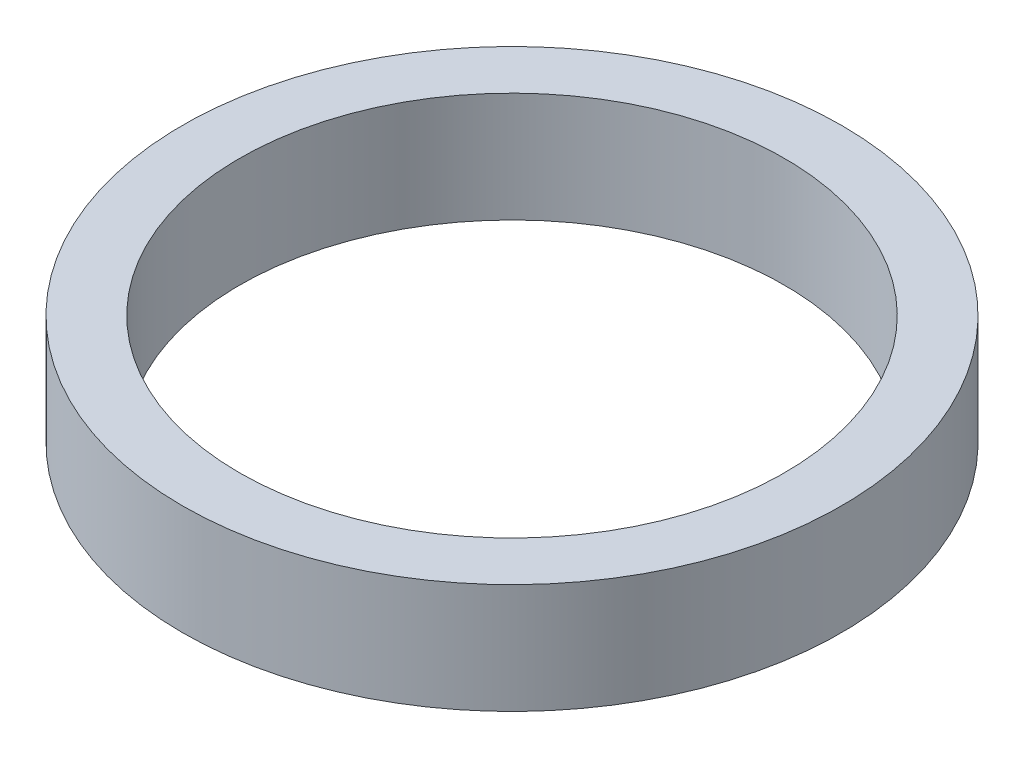
ISO-10303-21;
HEADER;
FILE_DESCRIPTION(('STEP AP214'),'2;1');
FILE_NAME('part.step','',(''),(''),'','','');
FILE_SCHEMA(('AUTOMOTIVE_DESIGN { 1 0 10303 214 1 1 1 1 }'));
ENDSEC;
DATA;
#1=APPLICATION_CONTEXT('core data for automotive mechanical design processes');
#2=APPLICATION_PROTOCOL_DEFINITION('international standard','automotive_design',2000,#1);
#3=PRODUCT_CONTEXT('',#1,'mechanical');
#4=PRODUCT('Part','Part','',(#3));
#5=PRODUCT_RELATED_PRODUCT_CATEGORY('part','',(#4));
#6=PRODUCT_DEFINITION_FORMATION('','',#4);
#7=PRODUCT_DEFINITION_CONTEXT('part definition',#1,'design');
#8=PRODUCT_DEFINITION('design','',#6,#7);
#9=PRODUCT_DEFINITION_SHAPE('','',#8);
#10=(LENGTH_UNIT() NAMED_UNIT(*) SI_UNIT(.MILLI.,.METRE.));
#11=(NAMED_UNIT(*) PLANE_ANGLE_UNIT() SI_UNIT($,.RADIAN.));
#12=(NAMED_UNIT(*) SI_UNIT($,.STERADIAN.) SOLID_ANGLE_UNIT());
#13=UNCERTAINTY_MEASURE_WITH_UNIT(LENGTH_MEASURE(1.E-05),#10,'distance_accuracy_value','');
#14=(GEOMETRIC_REPRESENTATION_CONTEXT(3) GLOBAL_UNCERTAINTY_ASSIGNED_CONTEXT((#13)) GLOBAL_UNIT_ASSIGNED_CONTEXT((#10,
#11,#12)) REPRESENTATION_CONTEXT('',''));
#15=CARTESIAN_POINT('',(0.,0.,0.));
#16=DIRECTION('',(0.,0.,1.));
#17=DIRECTION('',(1.,0.,0.));
#18=AXIS2_PLACEMENT_3D('',#15,#16,#17);
#19=CARTESIAN_POINT('',(0.,1.25,0.));
#20=DIRECTION('',(0.,1.,0.));
#21=DIRECTION('',(0.,0.,1.));
#22=AXIS2_PLACEMENT_3D('',#19,#20,#21);
#23=PLANE('',#22);
#24=CARTESIAN_POINT('',(0.,1.25,0.));
#25=DIRECTION('',(0.,1.,0.));
#26=DIRECTION('',(0.,0.,1.));
#27=AXIS2_PLACEMENT_3D('',#24,#25,#26);
#28=CIRCLE('',#27,3.75);
#29=CARTESIAN_POINT('',(0.,1.25,3.75));
#30=VERTEX_POINT('',#29);
#31=EDGE_CURVE('E10',#30,#30,#28,.T.);
#32=ORIENTED_EDGE('',*,*,#31,.T.);
#33=EDGE_LOOP('',(#32));
#34=FACE_BOUND('',#33,.T.);
#35=CARTESIAN_POINT('',(0.,1.25,0.));
#36=DIRECTION('',(0.,1.,0.));
#37=DIRECTION('',(0.,0.,1.));
#38=AXIS2_PLACEMENT_3D('',#35,#36,#37);
#39=CIRCLE('',#38,3.1);
#40=CARTESIAN_POINT('',(0.,1.25,3.1));
#41=VERTEX_POINT('',#40);
#42=EDGE_CURVE('E52',#41,#41,#39,.T.);
#43=ORIENTED_EDGE('',*,*,#42,.F.);
#44=EDGE_LOOP('',(#43));
#45=FACE_BOUND('',#44,.T.);
#46=ADVANCED_FACE('F41',(#34,#45),#23,.T.);
#47=CARTESIAN_POINT('',(0.,0.,0.));
#48=DIRECTION('',(0.,1.,0.));
#49=DIRECTION('',(0.,0.,1.));
#50=AXIS2_PLACEMENT_3D('',#47,#48,#49);
#51=PLANE('',#50);
#52=CARTESIAN_POINT('',(0.,0.,0.));
#53=DIRECTION('',(0.,1.,0.));
#54=DIRECTION('',(0.,0.,1.));
#55=AXIS2_PLACEMENT_3D('',#52,#53,#54);
#56=CIRCLE('',#55,3.75);
#57=CARTESIAN_POINT('',(0.,0.,3.75));
#58=VERTEX_POINT('',#57);
#59=EDGE_CURVE('E45',#58,#58,#56,.T.);
#60=ORIENTED_EDGE('',*,*,#59,.F.);
#61=EDGE_LOOP('',(#60));
#62=FACE_BOUND('',#61,.T.);
#63=CARTESIAN_POINT('',(0.,0.,0.));
#64=DIRECTION('',(0.,1.,0.));
#65=DIRECTION('',(0.,0.,1.));
#66=AXIS2_PLACEMENT_3D('',#63,#64,#65);
#67=CIRCLE('',#66,3.1);
#68=CARTESIAN_POINT('',(0.,0.,3.1));
#69=VERTEX_POINT('',#68);
#70=EDGE_CURVE('E54',#69,#69,#67,.T.);
#71=ORIENTED_EDGE('',*,*,#70,.T.);
#72=EDGE_LOOP('',(#71));
#73=FACE_BOUND('',#72,.T.);
#74=ADVANCED_FACE('F64',(#62,#73),#51,.F.);
#75=CARTESIAN_POINT('',(0.,1.25,0.));
#76=DIRECTION('',(0.,-1.,0.));
#77=DIRECTION('',(0.,0.,-1.));
#78=AXIS2_PLACEMENT_3D('',#75,#76,#77);
#79=CYLINDRICAL_SURFACE('',#78,3.75);
#80=ORIENTED_EDGE('',*,*,#31,.F.);
#81=EDGE_LOOP('',(#80));
#82=FACE_BOUND('',#81,.T.);
#83=ORIENTED_EDGE('',*,*,#59,.T.);
#84=EDGE_LOOP('',(#83));
#85=FACE_BOUND('',#84,.T.);
#86=ADVANCED_FACE('F43',(#82,#85),#79,.T.);
#87=CARTESIAN_POINT('',(0.,1.25,0.));
#88=DIRECTION('',(0.,-1.,0.));
#89=DIRECTION('',(0.,0.,-1.));
#90=AXIS2_PLACEMENT_3D('',#87,#88,#89);
#91=CYLINDRICAL_SURFACE('',#90,3.1);
#92=ORIENTED_EDGE('',*,*,#42,.T.);
#93=EDGE_LOOP('',(#92));
#94=FACE_BOUND('',#93,.T.);
#95=ORIENTED_EDGE('',*,*,#70,.F.);
#96=EDGE_LOOP('',(#95));
#97=FACE_BOUND('',#96,.T.);
#98=ADVANCED_FACE('F60',(#94,#97),#91,.F.);
#99=CLOSED_SHELL('',(#46,#74,#86,#98));
#100=MANIFOLD_SOLID_BREP('B2',#99);
#101=ADVANCED_BREP_SHAPE_REPRESENTATION('',(#18,#100),#14);
#102=SHAPE_DEFINITION_REPRESENTATION(#9,#101);
ENDSEC;
END-ISO-10303-21;
